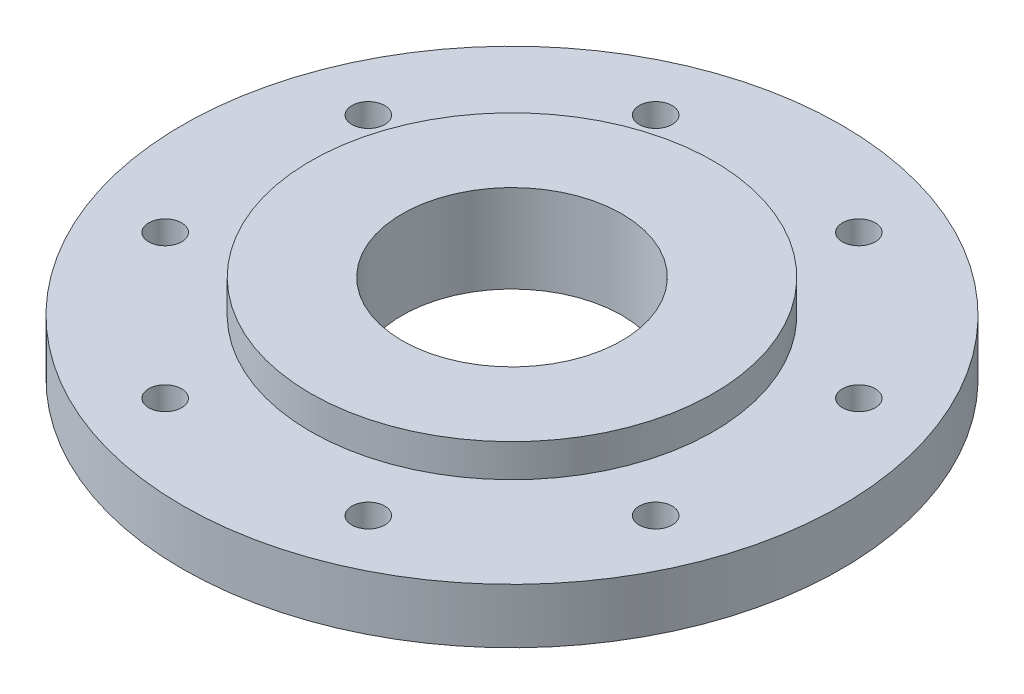
ISO-10303-21;
HEADER;
FILE_DESCRIPTION(('STEP AP214'),'2;1');
FILE_NAME('part.step','',(''),(''),'','','');
FILE_SCHEMA(('AUTOMOTIVE_DESIGN { 1 0 10303 214 1 1 1 1 }'));
ENDSEC;
DATA;
#1=APPLICATION_CONTEXT('core data for automotive mechanical design processes');
#2=APPLICATION_PROTOCOL_DEFINITION('international standard','automotive_design',2000,#1);
#3=PRODUCT_CONTEXT('',#1,'mechanical');
#4=PRODUCT('Part','Part','',(#3));
#5=PRODUCT_RELATED_PRODUCT_CATEGORY('part','',(#4));
#6=PRODUCT_DEFINITION_FORMATION('','',#4);
#7=PRODUCT_DEFINITION_CONTEXT('part definition',#1,'design');
#8=PRODUCT_DEFINITION('design','',#6,#7);
#9=PRODUCT_DEFINITION_SHAPE('','',#8);
#10=(LENGTH_UNIT() NAMED_UNIT(*) SI_UNIT(.MILLI.,.METRE.));
#11=(NAMED_UNIT(*) PLANE_ANGLE_UNIT() SI_UNIT($,.RADIAN.));
#12=(NAMED_UNIT(*) SI_UNIT($,.STERADIAN.) SOLID_ANGLE_UNIT());
#13=UNCERTAINTY_MEASURE_WITH_UNIT(LENGTH_MEASURE(1.E-05),#10,'distance_accuracy_value','');
#14=(GEOMETRIC_REPRESENTATION_CONTEXT(3) GLOBAL_UNCERTAINTY_ASSIGNED_CONTEXT((#13)) GLOBAL_UNIT_ASSIGNED_CONTEXT((#10,
#11,#12)) REPRESENTATION_CONTEXT('',''));
#15=CARTESIAN_POINT('',(0.,0.,0.));
#16=DIRECTION('',(0.,0.,1.));
#17=DIRECTION('',(1.,0.,0.));
#18=AXIS2_PLACEMENT_3D('',#15,#16,#17);
#19=CARTESIAN_POINT('',(0.,30.,0.));
#20=DIRECTION('',(0.,1.,0.));
#21=DIRECTION('',(0.,0.,1.));
#22=AXIS2_PLACEMENT_3D('',#19,#20,#21);
#23=PLANE('',#22);
#24=CARTESIAN_POINT('',(133.962532214137,30.,55.489097692938));
#25=DIRECTION('',(0.,1.,0.));
#26=DIRECTION('',(0.,0.,1.));
#27=AXIS2_PLACEMENT_3D('',#24,#25,#26);
#28=CIRCLE('',#27,9.00000000000001);
#29=CARTESIAN_POINT('',(133.962532214137,30.,64.489097692938));
#30=VERTEX_POINT('',#29);
#31=EDGE_CURVE('E92',#30,#30,#28,.T.);
#32=ORIENTED_EDGE('',*,*,#31,.F.);
#33=EDGE_LOOP('',(#32));
#34=FACE_BOUND('',#33,.T.);
#35=CARTESIAN_POINT('',(-55.489097692938,30.,133.962532214137));
#36=DIRECTION('',(0.,1.,0.));
#37=DIRECTION('',(0.,0.,1.));
#38=AXIS2_PLACEMENT_3D('',#35,#36,#37);
#39=CIRCLE('',#38,9.00000000000004);
#40=CARTESIAN_POINT('',(-55.489097692938,30.,142.962532214137));
#41=VERTEX_POINT('',#40);
#42=EDGE_CURVE('E80',#41,#41,#39,.T.);
#43=ORIENTED_EDGE('',*,*,#42,.F.);
#44=EDGE_LOOP('',(#43));
#45=FACE_BOUND('',#44,.T.);
#46=CARTESIAN_POINT('',(-133.962532214137,30.,-55.489097692938));
#47=DIRECTION('',(0.,1.,0.));
#48=DIRECTION('',(0.,0.,1.));
#49=AXIS2_PLACEMENT_3D('',#46,#47,#48);
#50=CIRCLE('',#49,8.99999999999998);
#51=CARTESIAN_POINT('',(-133.962532214137,30.,-46.489097692938));
#52=VERTEX_POINT('',#51);
#53=EDGE_CURVE('E68',#52,#52,#50,.T.);
#54=ORIENTED_EDGE('',*,*,#53,.F.);
#55=EDGE_LOOP('',(#54));
#56=FACE_BOUND('',#55,.T.);
#57=CARTESIAN_POINT('',(55.489097692938,30.,-133.962532214137));
#58=DIRECTION('',(0.,1.,0.));
#59=DIRECTION('',(0.,0.,1.));
#60=AXIS2_PLACEMENT_3D('',#57,#58,#59);
#61=CIRCLE('',#60,9.);
#62=CARTESIAN_POINT('',(55.489097692938,30.,-124.962532214137));
#63=VERTEX_POINT('',#62);
#64=EDGE_CURVE('E56',#63,#63,#61,.T.);
#65=ORIENTED_EDGE('',*,*,#64,.F.);
#66=EDGE_LOOP('',(#65));
#67=FACE_BOUND('',#66,.T.);
#68=CARTESIAN_POINT('',(0.,30.,0.));
#69=DIRECTION('',(0.,1.,0.));
#70=DIRECTION('',(0.,0.,1.));
#71=AXIS2_PLACEMENT_3D('',#68,#69,#70);
#72=CIRCLE('',#71,180.);
#73=CARTESIAN_POINT('',(0.,30.,180.));
#74=VERTEX_POINT('',#73);
#75=EDGE_CURVE('E10',#74,#74,#72,.T.);
#76=ORIENTED_EDGE('',*,*,#75,.T.);
#77=EDGE_LOOP('',(#76));
#78=FACE_BOUND('',#77,.T.);
#79=CARTESIAN_POINT('',(133.962532214137,30.,-55.489097692938));
#80=DIRECTION('',(0.,1.,0.));
#81=DIRECTION('',(0.,0.,1.));
#82=AXIS2_PLACEMENT_3D('',#79,#80,#81);
#83=CIRCLE('',#82,9.00000000000001);
#84=CARTESIAN_POINT('',(133.962532214137,30.,-46.489097692938));
#85=VERTEX_POINT('',#84);
#86=EDGE_CURVE('E52',#85,#85,#83,.T.);
#87=ORIENTED_EDGE('',*,*,#86,.F.);
#88=EDGE_LOOP('',(#87));
#89=FACE_BOUND('',#88,.T.);
#90=CARTESIAN_POINT('',(-55.489097692938,30.,-133.962532214137));
#91=DIRECTION('',(0.,1.,0.));
#92=DIRECTION('',(0.,0.,1.));
#93=AXIS2_PLACEMENT_3D('',#90,#91,#92);
#94=CIRCLE('',#93,9.00000000000001);
#95=CARTESIAN_POINT('',(-55.489097692938,30.,-124.962532214137));
#96=VERTEX_POINT('',#95);
#97=EDGE_CURVE('E62',#96,#96,#94,.T.);
#98=ORIENTED_EDGE('',*,*,#97,.F.);
#99=EDGE_LOOP('',(#98));
#100=FACE_BOUND('',#99,.T.);
#101=CARTESIAN_POINT('',(-133.962532214137,30.,55.489097692938));
#102=DIRECTION('',(0.,1.,0.));
#103=DIRECTION('',(0.,0.,1.));
#104=AXIS2_PLACEMENT_3D('',#101,#102,#103);
#105=CIRCLE('',#104,8.99999999999998);
#106=CARTESIAN_POINT('',(-133.962532214137,30.,64.489097692938));
#107=VERTEX_POINT('',#106);
#108=EDGE_CURVE('E74',#107,#107,#105,.T.);
#109=ORIENTED_EDGE('',*,*,#108,.F.);
#110=EDGE_LOOP('',(#109));
#111=FACE_BOUND('',#110,.T.);
#112=CARTESIAN_POINT('',(55.489097692938,30.,133.962532214137));
#113=DIRECTION('',(0.,1.,0.));
#114=DIRECTION('',(0.,0.,1.));
#115=AXIS2_PLACEMENT_3D('',#112,#113,#114);
#116=CIRCLE('',#115,9.00000000000002);
#117=CARTESIAN_POINT('',(55.489097692938,30.,142.962532214137));
#118=VERTEX_POINT('',#117);
#119=EDGE_CURVE('E86',#118,#118,#116,.T.);
#120=ORIENTED_EDGE('',*,*,#119,.F.);
#121=EDGE_LOOP('',(#120));
#122=FACE_BOUND('',#121,.T.);
#123=CARTESIAN_POINT('',(0.,30.,0.));
#124=DIRECTION('',(0.,1.,0.));
#125=DIRECTION('',(0.,0.,1.));
#126=AXIS2_PLACEMENT_3D('',#123,#124,#125);
#127=CIRCLE('',#126,110.);
#128=CARTESIAN_POINT('',(0.,30.,110.));
#129=VERTEX_POINT('',#128);
#130=EDGE_CURVE('E98',#129,#129,#127,.F.);
#131=ORIENTED_EDGE('',*,*,#130,.T.);
#132=EDGE_LOOP('',(#131));
#133=FACE_BOUND('',#132,.T.);
#134=ADVANCED_FACE('F37',(#34,#45,#56,#67,#78,#89,#100,#111,#122,#133),#23,.T.);
#135=CARTESIAN_POINT('',(0.,0.,0.));
#136=DIRECTION('',(0.,1.,0.));
#137=DIRECTION('',(0.,0.,1.));
#138=AXIS2_PLACEMENT_3D('',#135,#136,#137);
#139=PLANE('',#138);
#140=CARTESIAN_POINT('',(0.,0.,0.));
#141=DIRECTION('',(0.,1.,0.));
#142=DIRECTION('',(0.,0.,1.));
#143=AXIS2_PLACEMENT_3D('',#140,#141,#142);
#144=CIRCLE('',#143,60.);
#145=CARTESIAN_POINT('',(0.,0.,60.));
#146=VERTEX_POINT('',#145);
#147=EDGE_CURVE('E48',#146,#146,#144,.T.);
#148=ORIENTED_EDGE('',*,*,#147,.T.);
#149=EDGE_LOOP('',(#148));
#150=FACE_BOUND('',#149,.T.);
#151=CARTESIAN_POINT('',(133.962532214137,0.,55.489097692938));
#152=DIRECTION('',(0.,1.,0.));
#153=DIRECTION('',(0.,0.,1.));
#154=AXIS2_PLACEMENT_3D('',#151,#152,#153);
#155=CIRCLE('',#154,9.00000000000001);
#156=CARTESIAN_POINT('',(133.962532214137,0.,64.489097692938));
#157=VERTEX_POINT('',#156);
#158=EDGE_CURVE('E95',#157,#157,#155,.T.);
#159=ORIENTED_EDGE('',*,*,#158,.T.);
#160=EDGE_LOOP('',(#159));
#161=FACE_BOUND('',#160,.T.);
#162=CARTESIAN_POINT('',(55.489097692938,0.,133.962532214137));
#163=DIRECTION('',(0.,1.,0.));
#164=DIRECTION('',(0.,0.,1.));
#165=AXIS2_PLACEMENT_3D('',#162,#163,#164);
#166=CIRCLE('',#165,9.00000000000002);
#167=CARTESIAN_POINT('',(55.489097692938,0.,142.962532214137));
#168=VERTEX_POINT('',#167);
#169=EDGE_CURVE('E89',#168,#168,#166,.T.);
#170=ORIENTED_EDGE('',*,*,#169,.T.);
#171=EDGE_LOOP('',(#170));
#172=FACE_BOUND('',#171,.T.);
#173=CARTESIAN_POINT('',(-55.489097692938,0.,133.962532214137));
#174=DIRECTION('',(0.,1.,0.));
#175=DIRECTION('',(0.,0.,1.));
#176=AXIS2_PLACEMENT_3D('',#173,#174,#175);
#177=CIRCLE('',#176,9.00000000000004);
#178=CARTESIAN_POINT('',(-55.489097692938,0.,142.962532214137));
#179=VERTEX_POINT('',#178);
#180=EDGE_CURVE('E83',#179,#179,#177,.T.);
#181=ORIENTED_EDGE('',*,*,#180,.T.);
#182=EDGE_LOOP('',(#181));
#183=FACE_BOUND('',#182,.T.);
#184=CARTESIAN_POINT('',(-133.962532214137,0.,55.489097692938));
#185=DIRECTION('',(0.,1.,0.));
#186=DIRECTION('',(0.,0.,1.));
#187=AXIS2_PLACEMENT_3D('',#184,#185,#186);
#188=CIRCLE('',#187,8.99999999999998);
#189=CARTESIAN_POINT('',(-133.962532214137,0.,64.489097692938));
#190=VERTEX_POINT('',#189);
#191=EDGE_CURVE('E77',#190,#190,#188,.T.);
#192=ORIENTED_EDGE('',*,*,#191,.T.);
#193=EDGE_LOOP('',(#192));
#194=FACE_BOUND('',#193,.T.);
#195=CARTESIAN_POINT('',(-133.962532214137,0.,-55.489097692938));
#196=DIRECTION('',(0.,1.,0.));
#197=DIRECTION('',(0.,0.,1.));
#198=AXIS2_PLACEMENT_3D('',#195,#196,#197);
#199=CIRCLE('',#198,8.99999999999998);
#200=CARTESIAN_POINT('',(-133.962532214137,0.,-46.489097692938));
#201=VERTEX_POINT('',#200);
#202=EDGE_CURVE('E71',#201,#201,#199,.T.);
#203=ORIENTED_EDGE('',*,*,#202,.T.);
#204=EDGE_LOOP('',(#203));
#205=FACE_BOUND('',#204,.T.);
#206=CARTESIAN_POINT('',(-55.489097692938,0.,-133.962532214137));
#207=DIRECTION('',(0.,1.,0.));
#208=DIRECTION('',(0.,0.,1.));
#209=AXIS2_PLACEMENT_3D('',#206,#207,#208);
#210=CIRCLE('',#209,9.00000000000001);
#211=CARTESIAN_POINT('',(-55.489097692938,0.,-124.962532214137));
#212=VERTEX_POINT('',#211);
#213=EDGE_CURVE('E65',#212,#212,#210,.T.);
#214=ORIENTED_EDGE('',*,*,#213,.T.);
#215=EDGE_LOOP('',(#214));
#216=FACE_BOUND('',#215,.T.);
#217=CARTESIAN_POINT('',(55.489097692938,0.,-133.962532214137));
#218=DIRECTION('',(0.,1.,0.));
#219=DIRECTION('',(0.,0.,1.));
#220=AXIS2_PLACEMENT_3D('',#217,#218,#219);
#221=CIRCLE('',#220,9.);
#222=CARTESIAN_POINT('',(55.489097692938,0.,-124.962532214137));
#223=VERTEX_POINT('',#222);
#224=EDGE_CURVE('E59',#223,#223,#221,.T.);
#225=ORIENTED_EDGE('',*,*,#224,.T.);
#226=EDGE_LOOP('',(#225));
#227=FACE_BOUND('',#226,.T.);
#228=CARTESIAN_POINT('',(133.962532214137,0.,-55.489097692938));
#229=DIRECTION('',(0.,1.,0.));
#230=DIRECTION('',(0.,0.,1.));
#231=AXIS2_PLACEMENT_3D('',#228,#229,#230);
#232=CIRCLE('',#231,9.00000000000001);
#233=CARTESIAN_POINT('',(133.962532214137,0.,-46.489097692938));
#234=VERTEX_POINT('',#233);
#235=EDGE_CURVE('E53',#234,#234,#232,.T.);
#236=ORIENTED_EDGE('',*,*,#235,.T.);
#237=EDGE_LOOP('',(#236));
#238=FACE_BOUND('',#237,.T.);
#239=CARTESIAN_POINT('',(0.,0.,0.));
#240=DIRECTION('',(0.,1.,0.));
#241=DIRECTION('',(0.,0.,1.));
#242=AXIS2_PLACEMENT_3D('',#239,#240,#241);
#243=CIRCLE('',#242,180.);
#244=CARTESIAN_POINT('',(0.,0.,180.));
#245=VERTEX_POINT('',#244);
#246=EDGE_CURVE('E41',#245,#245,#243,.T.);
#247=ORIENTED_EDGE('',*,*,#246,.F.);
#248=EDGE_LOOP('',(#247));
#249=FACE_BOUND('',#248,.T.);
#250=ADVANCED_FACE('F128',(#150,#161,#172,#183,#194,#205,#216,#227,#238,#249),#139,.F.);
#251=CARTESIAN_POINT('',(0.,30.,0.));
#252=DIRECTION('',(0.,-1.,0.));
#253=DIRECTION('',(0.,0.,-1.));
#254=AXIS2_PLACEMENT_3D('',#251,#252,#253);
#255=CYLINDRICAL_SURFACE('',#254,180.);
#256=ORIENTED_EDGE('',*,*,#75,.F.);
#257=EDGE_LOOP('',(#256));
#258=FACE_BOUND('',#257,.T.);
#259=ORIENTED_EDGE('',*,*,#246,.T.);
#260=EDGE_LOOP('',(#259));
#261=FACE_BOUND('',#260,.T.);
#262=ADVANCED_FACE('F39',(#258,#261),#255,.T.);
#263=CARTESIAN_POINT('',(0.,30.,0.));
#264=DIRECTION('',(0.,-1.,0.));
#265=DIRECTION('',(0.,0.,-1.));
#266=AXIS2_PLACEMENT_3D('',#263,#264,#265);
#267=CYLINDRICAL_SURFACE('',#266,60.);
#268=ORIENTED_EDGE('',*,*,#147,.F.);
#269=EDGE_LOOP('',(#268));
#270=FACE_BOUND('',#269,.T.);
#271=CARTESIAN_POINT('',(0.,48.,0.));
#272=DIRECTION('',(0.,1.,0.));
#273=DIRECTION('',(0.,0.,1.));
#274=AXIS2_PLACEMENT_3D('',#271,#272,#273);
#275=CIRCLE('',#274,60.);
#276=CARTESIAN_POINT('',(0.,48.,60.));
#277=VERTEX_POINT('',#276);
#278=EDGE_CURVE('E106',#277,#277,#275,.T.);
#279=ORIENTED_EDGE('',*,*,#278,.T.);
#280=EDGE_LOOP('',(#279));
#281=FACE_BOUND('',#280,.T.);
#282=ADVANCED_FACE('F110',(#270,#281),#267,.F.);
#283=CARTESIAN_POINT('',(133.962532214137,30.,-55.489097692938));
#284=DIRECTION('',(0.,-1.,0.));
#285=DIRECTION('',(0.,0.,-1.));
#286=AXIS2_PLACEMENT_3D('',#283,#284,#285);
#287=CYLINDRICAL_SURFACE('',#286,9.00000000000001);
#288=ORIENTED_EDGE('',*,*,#86,.T.);
#289=EDGE_LOOP('',(#288));
#290=FACE_BOUND('',#289,.T.);
#291=ORIENTED_EDGE('',*,*,#235,.F.);
#292=EDGE_LOOP('',(#291));
#293=FACE_BOUND('',#292,.T.);
#294=ADVANCED_FACE('F140',(#290,#293),#287,.F.);
#295=CARTESIAN_POINT('',(55.489097692938,30.,-133.962532214137));
#296=DIRECTION('',(0.,-1.,0.));
#297=DIRECTION('',(0.,0.,-1.));
#298=AXIS2_PLACEMENT_3D('',#295,#296,#297);
#299=CYLINDRICAL_SURFACE('',#298,9.);
#300=ORIENTED_EDGE('',*,*,#64,.T.);
#301=EDGE_LOOP('',(#300));
#302=FACE_BOUND('',#301,.T.);
#303=ORIENTED_EDGE('',*,*,#224,.F.);
#304=EDGE_LOOP('',(#303));
#305=FACE_BOUND('',#304,.T.);
#306=ADVANCED_FACE('F144',(#302,#305),#299,.F.);
#307=CARTESIAN_POINT('',(-55.489097692938,30.,-133.962532214137));
#308=DIRECTION('',(0.,-1.,0.));
#309=DIRECTION('',(0.,0.,-1.));
#310=AXIS2_PLACEMENT_3D('',#307,#308,#309);
#311=CYLINDRICAL_SURFACE('',#310,9.00000000000001);
#312=ORIENTED_EDGE('',*,*,#97,.T.);
#313=EDGE_LOOP('',(#312));
#314=FACE_BOUND('',#313,.T.);
#315=ORIENTED_EDGE('',*,*,#213,.F.);
#316=EDGE_LOOP('',(#315));
#317=FACE_BOUND('',#316,.T.);
#318=ADVANCED_FACE('F148',(#314,#317),#311,.F.);
#319=CARTESIAN_POINT('',(-133.962532214137,30.,-55.489097692938));
#320=DIRECTION('',(0.,-1.,0.));
#321=DIRECTION('',(0.,0.,-1.));
#322=AXIS2_PLACEMENT_3D('',#319,#320,#321);
#323=CYLINDRICAL_SURFACE('',#322,8.99999999999998);
#324=ORIENTED_EDGE('',*,*,#53,.T.);
#325=EDGE_LOOP('',(#324));
#326=FACE_BOUND('',#325,.T.);
#327=ORIENTED_EDGE('',*,*,#202,.F.);
#328=EDGE_LOOP('',(#327));
#329=FACE_BOUND('',#328,.T.);
#330=ADVANCED_FACE('F152',(#326,#329),#323,.F.);
#331=CARTESIAN_POINT('',(-133.962532214137,30.,55.489097692938));
#332=DIRECTION('',(0.,-1.,0.));
#333=DIRECTION('',(0.,0.,-1.));
#334=AXIS2_PLACEMENT_3D('',#331,#332,#333);
#335=CYLINDRICAL_SURFACE('',#334,8.99999999999998);
#336=ORIENTED_EDGE('',*,*,#108,.T.);
#337=EDGE_LOOP('',(#336));
#338=FACE_BOUND('',#337,.T.);
#339=ORIENTED_EDGE('',*,*,#191,.F.);
#340=EDGE_LOOP('',(#339));
#341=FACE_BOUND('',#340,.T.);
#342=ADVANCED_FACE('F156',(#338,#341),#335,.F.);
#343=CARTESIAN_POINT('',(-55.489097692938,30.,133.962532214137));
#344=DIRECTION('',(0.,-1.,0.));
#345=DIRECTION('',(0.,0.,-1.));
#346=AXIS2_PLACEMENT_3D('',#343,#344,#345);
#347=CYLINDRICAL_SURFACE('',#346,9.00000000000004);
#348=ORIENTED_EDGE('',*,*,#42,.T.);
#349=EDGE_LOOP('',(#348));
#350=FACE_BOUND('',#349,.T.);
#351=ORIENTED_EDGE('',*,*,#180,.F.);
#352=EDGE_LOOP('',(#351));
#353=FACE_BOUND('',#352,.T.);
#354=ADVANCED_FACE('F160',(#350,#353),#347,.F.);
#355=CARTESIAN_POINT('',(55.489097692938,30.,133.962532214137));
#356=DIRECTION('',(0.,-1.,0.));
#357=DIRECTION('',(0.,0.,-1.));
#358=AXIS2_PLACEMENT_3D('',#355,#356,#357);
#359=CYLINDRICAL_SURFACE('',#358,9.00000000000002);
#360=ORIENTED_EDGE('',*,*,#119,.T.);
#361=EDGE_LOOP('',(#360));
#362=FACE_BOUND('',#361,.T.);
#363=ORIENTED_EDGE('',*,*,#169,.F.);
#364=EDGE_LOOP('',(#363));
#365=FACE_BOUND('',#364,.T.);
#366=ADVANCED_FACE('F124',(#362,#365),#359,.F.);
#367=CARTESIAN_POINT('',(133.962532214137,30.,55.489097692938));
#368=DIRECTION('',(0.,-1.,0.));
#369=DIRECTION('',(0.,0.,-1.));
#370=AXIS2_PLACEMENT_3D('',#367,#368,#369);
#371=CYLINDRICAL_SURFACE('',#370,9.00000000000001);
#372=ORIENTED_EDGE('',*,*,#31,.T.);
#373=EDGE_LOOP('',(#372));
#374=FACE_BOUND('',#373,.T.);
#375=ORIENTED_EDGE('',*,*,#158,.F.);
#376=EDGE_LOOP('',(#375));
#377=FACE_BOUND('',#376,.T.);
#378=ADVANCED_FACE('F115',(#374,#377),#371,.F.);
#379=CARTESIAN_POINT('',(0.,48.,0.));
#380=DIRECTION('',(0.,1.,0.));
#381=DIRECTION('',(0.,0.,1.));
#382=AXIS2_PLACEMENT_3D('',#379,#380,#381);
#383=PLANE('',#382);
#384=CARTESIAN_POINT('',(0.,48.,0.));
#385=DIRECTION('',(0.,1.,0.));
#386=DIRECTION('',(0.,0.,1.));
#387=AXIS2_PLACEMENT_3D('',#384,#385,#386);
#388=CIRCLE('',#387,110.);
#389=CARTESIAN_POINT('',(0.,48.,110.));
#390=VERTEX_POINT('',#389);
#391=EDGE_CURVE('E103',#390,#390,#388,.T.);
#392=ORIENTED_EDGE('',*,*,#391,.T.);
#393=EDGE_LOOP('',(#392));
#394=FACE_BOUND('',#393,.T.);
#395=ORIENTED_EDGE('',*,*,#278,.F.);
#396=EDGE_LOOP('',(#395));
#397=FACE_BOUND('',#396,.T.);
#398=ADVANCED_FACE('F112',(#394,#397),#383,.T.);
#399=CARTESIAN_POINT('',(0.,48.,0.));
#400=DIRECTION('',(0.,-1.,0.));
#401=DIRECTION('',(0.,0.,-1.));
#402=AXIS2_PLACEMENT_3D('',#399,#400,#401);
#403=CYLINDRICAL_SURFACE('',#402,110.);
#404=ORIENTED_EDGE('',*,*,#130,.F.);
#405=EDGE_LOOP('',(#404));
#406=FACE_BOUND('',#405,.T.);
#407=ORIENTED_EDGE('',*,*,#391,.F.);
#408=EDGE_LOOP('',(#407));
#409=FACE_BOUND('',#408,.T.);
#410=ADVANCED_FACE('F114',(#406,#409),#403,.T.);
#411=CLOSED_SHELL('',(#134,#250,#262,#282,#294,#306,#318,#330,#342,#354,#366,#378,#398,#410));
#412=MANIFOLD_SOLID_BREP('B2',#411);
#413=ADVANCED_BREP_SHAPE_REPRESENTATION('',(#18,#412),#14);
#414=SHAPE_DEFINITION_REPRESENTATION(#9,#413);
ENDSEC;
END-ISO-10303-21;
